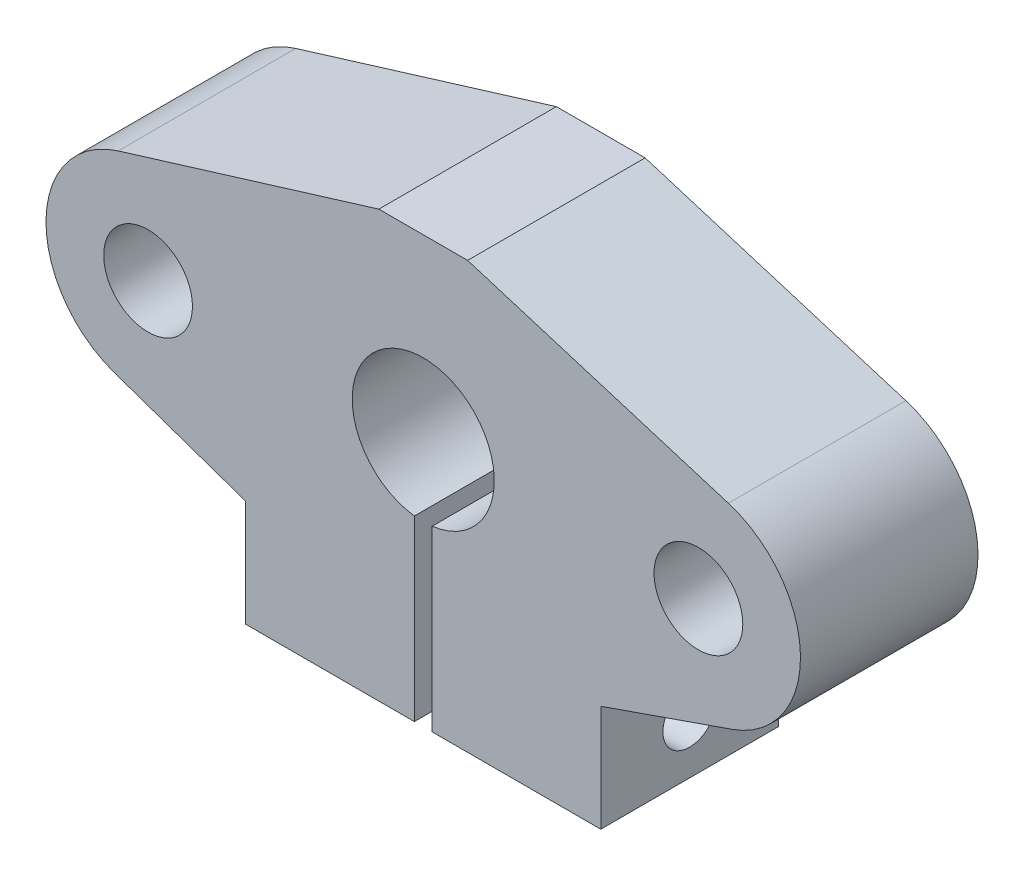
ISO-10303-21;
HEADER;
FILE_DESCRIPTION(('STEP AP214'),'2;1');
FILE_NAME('part.step','',(''),(''),'','','');
FILE_SCHEMA(('AUTOMOTIVE_DESIGN { 1 0 10303 214 1 1 1 1 }'));
ENDSEC;
DATA;
#1=APPLICATION_CONTEXT('core data for automotive mechanical design processes');
#2=APPLICATION_PROTOCOL_DEFINITION('international standard','automotive_design',2000,#1);
#3=PRODUCT_CONTEXT('',#1,'mechanical');
#4=PRODUCT('Part','Part','',(#3));
#5=PRODUCT_RELATED_PRODUCT_CATEGORY('part','',(#4));
#6=PRODUCT_DEFINITION_FORMATION('','',#4);
#7=PRODUCT_DEFINITION_CONTEXT('part definition',#1,'design');
#8=PRODUCT_DEFINITION('design','',#6,#7);
#9=PRODUCT_DEFINITION_SHAPE('','',#8);
#10=(LENGTH_UNIT() NAMED_UNIT(*) SI_UNIT(.MILLI.,.METRE.));
#11=(NAMED_UNIT(*) PLANE_ANGLE_UNIT() SI_UNIT($,.RADIAN.));
#12=(NAMED_UNIT(*) SI_UNIT($,.STERADIAN.) SOLID_ANGLE_UNIT());
#13=UNCERTAINTY_MEASURE_WITH_UNIT(LENGTH_MEASURE(1.E-05),#10,'distance_accuracy_value','');
#14=(GEOMETRIC_REPRESENTATION_CONTEXT(3) GLOBAL_UNCERTAINTY_ASSIGNED_CONTEXT((#13)) GLOBAL_UNIT_ASSIGNED_CONTEXT((#10,
#11,#12)) REPRESENTATION_CONTEXT('',''));
#15=CARTESIAN_POINT('',(0.,0.,0.));
#16=DIRECTION('',(0.,0.,1.));
#17=DIRECTION('',(1.,0.,0.));
#18=AXIS2_PLACEMENT_3D('',#15,#16,#17);
#19=CARTESIAN_POINT('',(15.5,1.99999999999999,10.));
#20=DIRECTION('',(0.,0.,-1.));
#21=DIRECTION('',(-1.,0.,0.));
#22=AXIS2_PLACEMENT_3D('',#19,#20,#21);
#23=CYLINDRICAL_SURFACE('',#22,5.74999999999223);
#24=CARTESIAN_POINT('',(15.5,1.99999999999999,0.));
#25=DIRECTION('',(0.,0.,1.));
#26=DIRECTION('',(1.,0.,0.));
#27=AXIS2_PLACEMENT_3D('',#24,#25,#26);
#28=CIRCLE('',#27,5.74999999999223);
#29=CARTESIAN_POINT('',(17.1855103593292,7.49741346712291,0.));
#30=VERTEX_POINT('',#29);
#31=CARTESIAN_POINT('',(17.3883763446684,-3.43107123694835,0.));
#32=VERTEX_POINT('',#31);
#33=EDGE_CURVE('E185',#30,#32,#28,.F.);
#34=ORIENTED_EDGE('',*,*,#33,.F.);
#35=DIRECTION('',(0.,0.,-1.));
#36=VECTOR('',#35,1.);
#37=CARTESIAN_POINT('',(17.1855103593292,7.49741346712291,10.));
#38=LINE('',#37,#36);
#39=CARTESIAN_POINT('',(17.1855103593292,7.49741346712291,10.));
#40=VERTEX_POINT('',#39);
#41=EDGE_CURVE('E11',#40,#30,#38,.T.);
#42=ORIENTED_EDGE('',*,*,#41,.F.);
#43=CARTESIAN_POINT('',(15.5,1.99999999999999,10.));
#44=DIRECTION('',(0.,0.,1.));
#45=DIRECTION('',(1.,0.,0.));
#46=AXIS2_PLACEMENT_3D('',#43,#44,#45);
#47=CIRCLE('',#46,5.74999999999223);
#48=CARTESIAN_POINT('',(17.3883763446684,-3.43107123694835,10.));
#49=VERTEX_POINT('',#48);
#50=EDGE_CURVE('E345',#40,#49,#47,.F.);
#51=ORIENTED_EDGE('',*,*,#50,.T.);
#52=DIRECTION('',(0.,0.,-1.));
#53=VECTOR('',#52,1.);
#54=CARTESIAN_POINT('',(17.3883763446684,-3.43107123694835,10.));
#55=LINE('',#54,#53);
#56=EDGE_CURVE('E114',#49,#32,#55,.T.);
#57=ORIENTED_EDGE('',*,*,#56,.T.);
#58=EDGE_LOOP('',(#34,#42,#51,#57));
#59=FACE_BOUND('',#58,.T.);
#60=ADVANCED_FACE('F44',(#59),#23,.T.);
#61=CARTESIAN_POINT('',(3.57788222635894,11.6695206446507,10.));
#62=DIRECTION('',(0.293132236405484,0.956071907327017,0.));
#63=DIRECTION('',(-0.956071907327017,0.293132236405484,0.));
#64=AXIS2_PLACEMENT_3D('',#61,#62,#63);
#65=PLANE('',#64);
#66=DIRECTION('',(0.956071907327017,-0.293132236405484,0.));
#67=VECTOR('',#66,1.);
#68=CARTESIAN_POINT('',(3.57788222635894,11.6695206446507,0.));
#69=LINE('',#68,#67);
#70=CARTESIAN_POINT('',(2.5,11.999999999993,0.));
#71=VERTEX_POINT('',#70);
#72=EDGE_CURVE('E188',#71,#30,#69,.T.);
#73=ORIENTED_EDGE('',*,*,#72,.F.);
#74=DIRECTION('',(0.,0.,-1.));
#75=VECTOR('',#74,1.);
#76=CARTESIAN_POINT('',(2.5,11.999999999993,10.));
#77=LINE('',#76,#75);
#78=CARTESIAN_POINT('',(2.5,11.999999999993,10.));
#79=VERTEX_POINT('',#78);
#80=EDGE_CURVE('E53',#79,#71,#77,.T.);
#81=ORIENTED_EDGE('',*,*,#80,.F.);
#82=DIRECTION('',(0.956071907327017,-0.293132236405484,0.));
#83=VECTOR('',#82,1.);
#84=CARTESIAN_POINT('',(3.57788222635894,11.6695206446507,10.));
#85=LINE('',#84,#83);
#86=EDGE_CURVE('E260',#79,#40,#85,.T.);
#87=ORIENTED_EDGE('',*,*,#86,.T.);
#88=ORIENTED_EDGE('',*,*,#41,.T.);
#89=EDGE_LOOP('',(#73,#81,#87,#88));
#90=FACE_BOUND('',#89,.T.);
#91=ADVANCED_FACE('F259',(#90),#65,.T.);
#92=CARTESIAN_POINT('',(0.,11.999999999993,10.));
#93=DIRECTION('',(0.,-1.,0.));
#94=DIRECTION('',(0.,0.,-1.));
#95=AXIS2_PLACEMENT_3D('',#92,#93,#94);
#96=PLANE('',#95);
#97=DIRECTION('',(-1.,0.,0.));
#98=VECTOR('',#97,1.);
#99=CARTESIAN_POINT('',(0.,11.999999999993,0.));
#100=LINE('',#99,#98);
#101=CARTESIAN_POINT('',(-2.5,11.999999999993,0.));
#102=VERTEX_POINT('',#101);
#103=EDGE_CURVE('E191',#71,#102,#100,.T.);
#104=ORIENTED_EDGE('',*,*,#103,.T.);
#105=DIRECTION('',(0.,0.,-1.));
#106=VECTOR('',#105,1.);
#107=CARTESIAN_POINT('',(-2.5,11.999999999993,10.));
#108=LINE('',#107,#106);
#109=CARTESIAN_POINT('',(-2.5,11.999999999993,10.));
#110=VERTEX_POINT('',#109);
#111=EDGE_CURVE('E244',#110,#102,#108,.T.);
#112=ORIENTED_EDGE('',*,*,#111,.F.);
#113=DIRECTION('',(-1.,0.,0.));
#114=VECTOR('',#113,1.);
#115=CARTESIAN_POINT('',(0.,11.999999999993,10.));
#116=LINE('',#115,#114);
#117=EDGE_CURVE('E252',#79,#110,#116,.T.);
#118=ORIENTED_EDGE('',*,*,#117,.F.);
#119=ORIENTED_EDGE('',*,*,#80,.T.);
#120=EDGE_LOOP('',(#104,#112,#118,#119));
#121=FACE_BOUND('',#120,.T.);
#122=ADVANCED_FACE('F249',(#121),#96,.F.);
#123=CARTESIAN_POINT('',(-3.57788222635894,11.6695206446507,10.));
#124=DIRECTION('',(0.293132236405483,-0.956071907327017,0.));
#125=DIRECTION('',(0.956071907327017,0.293132236405483,0.));
#126=AXIS2_PLACEMENT_3D('',#123,#124,#125);
#127=PLANE('',#126);
#128=DIRECTION('',(-0.956071907327017,-0.293132236405483,0.));
#129=VECTOR('',#128,1.);
#130=CARTESIAN_POINT('',(-3.57788222635894,11.6695206446507,0.));
#131=LINE('',#130,#129);
#132=CARTESIAN_POINT('',(-17.1855103593292,7.49741346712292,0.));
#133=VERTEX_POINT('',#132);
#134=EDGE_CURVE('E194',#102,#133,#131,.T.);
#135=ORIENTED_EDGE('',*,*,#134,.T.);
#136=DIRECTION('',(0.,0.,-1.));
#137=VECTOR('',#136,1.);
#138=CARTESIAN_POINT('',(-17.1855103593292,7.49741346712292,10.));
#139=LINE('',#138,#137);
#140=CARTESIAN_POINT('',(-17.1855103593292,7.49741346712292,10.));
#141=VERTEX_POINT('',#140);
#142=EDGE_CURVE('E241',#141,#133,#139,.T.);
#143=ORIENTED_EDGE('',*,*,#142,.F.);
#144=DIRECTION('',(-0.956071907327017,-0.293132236405483,0.));
#145=VECTOR('',#144,1.);
#146=CARTESIAN_POINT('',(-3.57788222635894,11.6695206446507,10.));
#147=LINE('',#146,#145);
#148=EDGE_CURVE('E349',#110,#141,#147,.T.);
#149=ORIENTED_EDGE('',*,*,#148,.F.);
#150=ORIENTED_EDGE('',*,*,#111,.T.);
#151=EDGE_LOOP('',(#135,#143,#149,#150));
#152=FACE_BOUND('',#151,.T.);
#153=ADVANCED_FACE('F269',(#152),#127,.F.);
#154=CARTESIAN_POINT('',(-15.5,2.,10.));
#155=DIRECTION('',(0.,0.,-1.));
#156=DIRECTION('',(-1.,0.,0.));
#157=AXIS2_PLACEMENT_3D('',#154,#155,#156);
#158=CYLINDRICAL_SURFACE('',#157,5.74999999999223);
#159=CARTESIAN_POINT('',(-15.5,2.,0.));
#160=DIRECTION('',(0.,0.,1.));
#161=DIRECTION('',(1.,0.,0.));
#162=AXIS2_PLACEMENT_3D('',#159,#160,#161);
#163=CIRCLE('',#162,5.74999999999223);
#164=CARTESIAN_POINT('',(-17.3883763446684,-3.43107123694835,0.));
#165=VERTEX_POINT('',#164);
#166=EDGE_CURVE('E197',#133,#165,#163,.T.);
#167=ORIENTED_EDGE('',*,*,#166,.T.);
#168=DIRECTION('',(0.,0.,-1.));
#169=VECTOR('',#168,1.);
#170=CARTESIAN_POINT('',(-17.3883763446684,-3.43107123694835,10.));
#171=LINE('',#170,#169);
#172=CARTESIAN_POINT('',(-17.3883763446684,-3.43107123694835,10.));
#173=VERTEX_POINT('',#172);
#174=EDGE_CURVE('E239',#173,#165,#171,.T.);
#175=ORIENTED_EDGE('',*,*,#174,.F.);
#176=CARTESIAN_POINT('',(-15.5,2.,10.));
#177=DIRECTION('',(0.,0.,1.));
#178=DIRECTION('',(1.,0.,0.));
#179=AXIS2_PLACEMENT_3D('',#176,#177,#178);
#180=CIRCLE('',#179,5.74999999999223);
#181=EDGE_CURVE('E352',#141,#173,#180,.T.);
#182=ORIENTED_EDGE('',*,*,#181,.F.);
#183=ORIENTED_EDGE('',*,*,#142,.T.);
#184=EDGE_LOOP('',(#167,#175,#182,#183));
#185=FACE_BOUND('',#184,.T.);
#186=ADVANCED_FACE('F272',(#185),#158,.T.);
#187=CARTESIAN_POINT('',(-2.93973809880274,-8.45484380147361,10.));
#188=DIRECTION('',(-0.328413277334074,-0.944534128166205,0.));
#189=DIRECTION('',(0.944534128166205,-0.328413277334074,0.));
#190=AXIS2_PLACEMENT_3D('',#187,#188,#189);
#191=PLANE('',#190);
#192=DIRECTION('',(-0.944534128166205,0.328413277334074,0.));
#193=VECTOR('',#192,1.);
#194=CARTESIAN_POINT('',(-2.93973809880274,-8.45484380147361,0.));
#195=LINE('',#194,#193);
#196=CARTESIAN_POINT('',(-10.,-6.,0.));
#197=VERTEX_POINT('',#196);
#198=EDGE_CURVE('E200',#197,#165,#195,.T.);
#199=ORIENTED_EDGE('',*,*,#198,.F.);
#200=DIRECTION('',(0.,0.,-1.));
#201=VECTOR('',#200,1.);
#202=CARTESIAN_POINT('',(-10.,-6.,10.));
#203=LINE('',#202,#201);
#204=CARTESIAN_POINT('',(-10.,-6.,10.));
#205=VERTEX_POINT('',#204);
#206=EDGE_CURVE('E237',#205,#197,#203,.T.);
#207=ORIENTED_EDGE('',*,*,#206,.F.);
#208=DIRECTION('',(-0.944534128166205,0.328413277334074,0.));
#209=VECTOR('',#208,1.);
#210=CARTESIAN_POINT('',(-2.93973809880274,-8.45484380147361,10.));
#211=LINE('',#210,#209);
#212=EDGE_CURVE('E354',#205,#173,#211,.T.);
#213=ORIENTED_EDGE('',*,*,#212,.T.);
#214=ORIENTED_EDGE('',*,*,#174,.T.);
#215=EDGE_LOOP('',(#199,#207,#213,#214));
#216=FACE_BOUND('',#215,.T.);
#217=ADVANCED_FACE('F276',(#216),#191,.T.);
#218=CARTESIAN_POINT('',(-10.,0.,10.));
#219=DIRECTION('',(-1.,0.,0.));
#220=DIRECTION('',(0.,0.,1.));
#221=AXIS2_PLACEMENT_3D('',#218,#219,#220);
#222=PLANE('',#221);
#223=CARTESIAN_POINT('',(-10.,-8.99999999999999,5.));
#224=DIRECTION('',(-1.,0.,0.));
#225=DIRECTION('',(0.,0.,1.));
#226=AXIS2_PLACEMENT_3D('',#223,#224,#225);
#227=CIRCLE('',#226,1.5);
#228=CARTESIAN_POINT('',(-10.,-8.99999999999999,6.5));
#229=VERTEX_POINT('',#228);
#230=EDGE_CURVE('E186',#229,#229,#227,.T.);
#231=ORIENTED_EDGE('',*,*,#230,.F.);
#232=EDGE_LOOP('',(#231));
#233=FACE_BOUND('',#232,.T.);
#234=DIRECTION('',(0.,1.,0.));
#235=VECTOR('',#234,1.);
#236=CARTESIAN_POINT('',(-10.,0.,0.));
#237=LINE('',#236,#235);
#238=CARTESIAN_POINT('',(-10.,-12.,0.));
#239=VERTEX_POINT('',#238);
#240=EDGE_CURVE('E203',#239,#197,#237,.T.);
#241=ORIENTED_EDGE('',*,*,#240,.F.);
#242=DIRECTION('',(0.,0.,-1.));
#243=VECTOR('',#242,1.);
#244=CARTESIAN_POINT('',(-10.,-12.,10.));
#245=LINE('',#244,#243);
#246=CARTESIAN_POINT('',(-10.,-12.,10.));
#247=VERTEX_POINT('',#246);
#248=EDGE_CURVE('E235',#247,#239,#245,.T.);
#249=ORIENTED_EDGE('',*,*,#248,.F.);
#250=DIRECTION('',(0.,1.,0.));
#251=VECTOR('',#250,1.);
#252=CARTESIAN_POINT('',(-10.,0.,10.));
#253=LINE('',#252,#251);
#254=EDGE_CURVE('E357',#247,#205,#253,.T.);
#255=ORIENTED_EDGE('',*,*,#254,.T.);
#256=ORIENTED_EDGE('',*,*,#206,.T.);
#257=EDGE_LOOP('',(#241,#249,#255,#256));
#258=FACE_BOUND('',#257,.T.);
#259=ADVANCED_FACE('F280',(#233,#258),#222,.T.);
#260=CARTESIAN_POINT('',(0.,-12.,10.));
#261=DIRECTION('',(0.,-1.,0.));
#262=DIRECTION('',(0.,0.,-1.));
#263=AXIS2_PLACEMENT_3D('',#260,#261,#262);
#264=PLANE('',#263);
#265=DIRECTION('',(-1.,0.,0.));
#266=VECTOR('',#265,1.);
#267=CARTESIAN_POINT('',(0.,-12.,0.));
#268=LINE('',#267,#266);
#269=CARTESIAN_POINT('',(-0.499999999999999,-12.,0.));
#270=VERTEX_POINT('',#269);
#271=EDGE_CURVE('E206',#270,#239,#268,.T.);
#272=ORIENTED_EDGE('',*,*,#271,.F.);
#273=DIRECTION('',(0.,0.,-1.));
#274=VECTOR('',#273,1.);
#275=CARTESIAN_POINT('',(-0.499999999999999,-12.,10.));
#276=LINE('',#275,#274);
#277=CARTESIAN_POINT('',(-0.499999999999999,-12.,10.));
#278=VERTEX_POINT('',#277);
#279=EDGE_CURVE('E233',#278,#270,#276,.T.);
#280=ORIENTED_EDGE('',*,*,#279,.F.);
#281=DIRECTION('',(-1.,0.,0.));
#282=VECTOR('',#281,1.);
#283=CARTESIAN_POINT('',(0.,-12.,10.));
#284=LINE('',#283,#282);
#285=EDGE_CURVE('E360',#278,#247,#284,.T.);
#286=ORIENTED_EDGE('',*,*,#285,.T.);
#287=ORIENTED_EDGE('',*,*,#248,.T.);
#288=EDGE_LOOP('',(#272,#280,#286,#287));
#289=FACE_BOUND('',#288,.T.);
#290=ADVANCED_FACE('F284',(#289),#264,.T.);
#291=CARTESIAN_POINT('',(-0.5,0.,10.));
#292=DIRECTION('',(1.,0.,0.));
#293=DIRECTION('',(0.,1.,0.));
#294=AXIS2_PLACEMENT_3D('',#291,#292,#293);
#295=PLANE('',#294);
#296=CARTESIAN_POINT('',(-0.5,-9.,5.));
#297=DIRECTION('',(1.,0.,0.));
#298=DIRECTION('',(0.,1.,0.));
#299=AXIS2_PLACEMENT_3D('',#296,#297,#298);
#300=CIRCLE('',#299,1.5);
#301=CARTESIAN_POINT('',(-0.500000000000001,-7.5,5.));
#302=VERTEX_POINT('',#301);
#303=EDGE_CURVE('E336',#302,#302,#300,.T.);
#304=ORIENTED_EDGE('',*,*,#303,.F.);
#305=EDGE_LOOP('',(#304));
#306=FACE_BOUND('',#305,.T.);
#307=DIRECTION('',(0.,-1.,0.));
#308=VECTOR('',#307,1.);
#309=CARTESIAN_POINT('',(-0.5,0.,0.));
#310=LINE('',#309,#308);
#311=CARTESIAN_POINT('',(-0.499999999999999,-1.96862696659689,0.));
#312=VERTEX_POINT('',#311);
#313=EDGE_CURVE('E209',#312,#270,#310,.T.);
#314=ORIENTED_EDGE('',*,*,#313,.F.);
#315=DIRECTION('',(0.,0.,-1.));
#316=VECTOR('',#315,1.);
#317=CARTESIAN_POINT('',(-0.499999999999999,-1.96862696659689,10.));
#318=LINE('',#317,#316);
#319=CARTESIAN_POINT('',(-0.499999999999999,-1.96862696659689,10.));
#320=VERTEX_POINT('',#319);
#321=EDGE_CURVE('E231',#320,#312,#318,.T.);
#322=ORIENTED_EDGE('',*,*,#321,.F.);
#323=DIRECTION('',(0.,-1.,0.));
#324=VECTOR('',#323,1.);
#325=CARTESIAN_POINT('',(-0.5,0.,10.));
#326=LINE('',#325,#324);
#327=EDGE_CURVE('E363',#320,#278,#326,.T.);
#328=ORIENTED_EDGE('',*,*,#327,.T.);
#329=ORIENTED_EDGE('',*,*,#279,.T.);
#330=EDGE_LOOP('',(#314,#322,#328,#329));
#331=FACE_BOUND('',#330,.T.);
#332=ADVANCED_FACE('F288',(#306,#331),#295,.T.);
#333=CARTESIAN_POINT('',(0.,2.,10.));
#334=DIRECTION('',(0.,0.,-1.));
#335=DIRECTION('',(-1.,0.,0.));
#336=AXIS2_PLACEMENT_3D('',#333,#334,#335);
#337=CYLINDRICAL_SURFACE('',#336,4.);
#338=CARTESIAN_POINT('',(0.,2.,0.));
#339=DIRECTION('',(0.,0.,1.));
#340=DIRECTION('',(1.,0.,0.));
#341=AXIS2_PLACEMENT_3D('',#338,#339,#340);
#342=CIRCLE('',#341,4.);
#343=CARTESIAN_POINT('',(0.500000000000001,-1.96862696659689,0.));
#344=VERTEX_POINT('',#343);
#345=EDGE_CURVE('E212',#344,#312,#342,.T.);
#346=ORIENTED_EDGE('',*,*,#345,.F.);
#347=DIRECTION('',(0.,0.,-1.));
#348=VECTOR('',#347,1.);
#349=CARTESIAN_POINT('',(0.500000000000001,-1.96862696659689,10.));
#350=LINE('',#349,#348);
#351=CARTESIAN_POINT('',(0.500000000000001,-1.96862696659689,10.));
#352=VERTEX_POINT('',#351);
#353=EDGE_CURVE('E229',#352,#344,#350,.T.);
#354=ORIENTED_EDGE('',*,*,#353,.F.);
#355=CARTESIAN_POINT('',(0.,2.,10.));
#356=DIRECTION('',(0.,0.,1.));
#357=DIRECTION('',(1.,0.,0.));
#358=AXIS2_PLACEMENT_3D('',#355,#356,#357);
#359=CIRCLE('',#358,4.);
#360=EDGE_CURVE('E174',#352,#320,#359,.T.);
#361=ORIENTED_EDGE('',*,*,#360,.T.);
#362=ORIENTED_EDGE('',*,*,#321,.T.);
#363=EDGE_LOOP('',(#346,#354,#361,#362));
#364=FACE_BOUND('',#363,.T.);
#365=ADVANCED_FACE('F292',(#364),#337,.F.);
#366=CARTESIAN_POINT('',(0.500000000000001,0.,10.));
#367=DIRECTION('',(-1.,0.,0.));
#368=DIRECTION('',(0.,0.,1.));
#369=AXIS2_PLACEMENT_3D('',#366,#367,#368);
#370=PLANE('',#369);
#371=CARTESIAN_POINT('',(0.5,-9.,5.));
#372=DIRECTION('',(-1.,0.,0.));
#373=DIRECTION('',(0.,0.,1.));
#374=AXIS2_PLACEMENT_3D('',#371,#372,#373);
#375=CIRCLE('',#374,1.5);
#376=CARTESIAN_POINT('',(0.5,-9.,6.5));
#377=VERTEX_POINT('',#376);
#378=EDGE_CURVE('E331',#377,#377,#375,.T.);
#379=ORIENTED_EDGE('',*,*,#378,.F.);
#380=EDGE_LOOP('',(#379));
#381=FACE_BOUND('',#380,.T.);
#382=DIRECTION('',(0.,1.,0.));
#383=VECTOR('',#382,1.);
#384=CARTESIAN_POINT('',(0.500000000000001,0.,0.));
#385=LINE('',#384,#383);
#386=CARTESIAN_POINT('',(0.5,-12.,0.));
#387=VERTEX_POINT('',#386);
#388=EDGE_CURVE('E215',#387,#344,#385,.T.);
#389=ORIENTED_EDGE('',*,*,#388,.F.);
#390=DIRECTION('',(0.,0.,-1.));
#391=VECTOR('',#390,1.);
#392=CARTESIAN_POINT('',(0.5,-12.,10.));
#393=LINE('',#392,#391);
#394=CARTESIAN_POINT('',(0.5,-12.,10.));
#395=VERTEX_POINT('',#394);
#396=EDGE_CURVE('E160',#395,#387,#393,.T.);
#397=ORIENTED_EDGE('',*,*,#396,.F.);
#398=DIRECTION('',(0.,1.,0.));
#399=VECTOR('',#398,1.);
#400=CARTESIAN_POINT('',(0.500000000000001,0.,10.));
#401=LINE('',#400,#399);
#402=EDGE_CURVE('E172',#395,#352,#401,.T.);
#403=ORIENTED_EDGE('',*,*,#402,.T.);
#404=ORIENTED_EDGE('',*,*,#353,.T.);
#405=EDGE_LOOP('',(#389,#397,#403,#404));
#406=FACE_BOUND('',#405,.T.);
#407=ADVANCED_FACE('F296',(#381,#406),#370,.T.);
#408=CARTESIAN_POINT('',(0.,-12.,10.));
#409=DIRECTION('',(0.,-1.,0.));
#410=DIRECTION('',(0.,0.,-1.));
#411=AXIS2_PLACEMENT_3D('',#408,#409,#410);
#412=PLANE('',#411);
#413=DIRECTION('',(-1.,0.,0.));
#414=VECTOR('',#413,1.);
#415=CARTESIAN_POINT('',(0.,-12.,0.));
#416=LINE('',#415,#414);
#417=CARTESIAN_POINT('',(10.,-12.,0.));
#418=VERTEX_POINT('',#417);
#419=EDGE_CURVE('E157',#418,#387,#416,.T.);
#420=ORIENTED_EDGE('',*,*,#419,.F.);
#421=DIRECTION('',(0.,0.,-1.));
#422=VECTOR('',#421,1.);
#423=CARTESIAN_POINT('',(10.,-12.,10.));
#424=LINE('',#423,#422);
#425=CARTESIAN_POINT('',(10.,-12.,10.));
#426=VERTEX_POINT('',#425);
#427=EDGE_CURVE('E151',#426,#418,#424,.T.);
#428=ORIENTED_EDGE('',*,*,#427,.F.);
#429=DIRECTION('',(-1.,0.,0.));
#430=VECTOR('',#429,1.);
#431=CARTESIAN_POINT('',(0.,-12.,10.));
#432=LINE('',#431,#430);
#433=EDGE_CURVE('E155',#426,#395,#432,.T.);
#434=ORIENTED_EDGE('',*,*,#433,.T.);
#435=ORIENTED_EDGE('',*,*,#396,.T.);
#436=EDGE_LOOP('',(#420,#428,#434,#435));
#437=FACE_BOUND('',#436,.T.);
#438=ADVANCED_FACE('F153',(#437),#412,.T.);
#439=CARTESIAN_POINT('',(10.,0.,10.));
#440=DIRECTION('',(-1.,0.,0.));
#441=DIRECTION('',(0.,-1.,0.));
#442=AXIS2_PLACEMENT_3D('',#439,#440,#441);
#443=PLANE('',#442);
#444=CARTESIAN_POINT('',(10.,-9.,5.));
#445=DIRECTION('',(1.,0.,0.));
#446=DIRECTION('',(0.,1.,0.));
#447=AXIS2_PLACEMENT_3D('',#444,#445,#446);
#448=CIRCLE('',#447,1.5);
#449=CARTESIAN_POINT('',(10.,-7.5,5.));
#450=VERTEX_POINT('',#449);
#451=EDGE_CURVE('E334',#450,#450,#448,.T.);
#452=ORIENTED_EDGE('',*,*,#451,.F.);
#453=EDGE_LOOP('',(#452));
#454=FACE_BOUND('',#453,.T.);
#455=DIRECTION('',(0.,1.,0.));
#456=VECTOR('',#455,1.);
#457=CARTESIAN_POINT('',(10.,0.,0.));
#458=LINE('',#457,#456);
#459=CARTESIAN_POINT('',(10.,-6.,0.));
#460=VERTEX_POINT('',#459);
#461=EDGE_CURVE('E219',#418,#460,#458,.T.);
#462=ORIENTED_EDGE('',*,*,#461,.T.);
#463=DIRECTION('',(0.,0.,-1.));
#464=VECTOR('',#463,1.);
#465=CARTESIAN_POINT('',(10.,-6.,10.));
#466=LINE('',#465,#464);
#467=CARTESIAN_POINT('',(10.,-6.,10.));
#468=VERTEX_POINT('',#467);
#469=EDGE_CURVE('E161',#468,#460,#466,.T.);
#470=ORIENTED_EDGE('',*,*,#469,.F.);
#471=DIRECTION('',(0.,1.,0.));
#472=VECTOR('',#471,1.);
#473=CARTESIAN_POINT('',(10.,0.,10.));
#474=LINE('',#473,#472);
#475=EDGE_CURVE('E164',#426,#468,#474,.T.);
#476=ORIENTED_EDGE('',*,*,#475,.F.);
#477=ORIENTED_EDGE('',*,*,#427,.T.);
#478=EDGE_LOOP('',(#462,#470,#476,#477));
#479=FACE_BOUND('',#478,.T.);
#480=ADVANCED_FACE('F165',(#454,#479),#443,.F.);
#481=CARTESIAN_POINT('',(2.93973809880274,-8.45484380147361,10.));
#482=DIRECTION('',(-0.328413277334073,0.944534128166205,0.));
#483=DIRECTION('',(-0.944534128166205,-0.328413277334073,0.));
#484=AXIS2_PLACEMENT_3D('',#481,#482,#483);
#485=PLANE('',#484);
#486=DIRECTION('',(0.944534128166205,0.328413277334073,0.));
#487=VECTOR('',#486,1.);
#488=CARTESIAN_POINT('',(2.93973809880274,-8.45484380147361,0.));
#489=LINE('',#488,#487);
#490=EDGE_CURVE('E107',#460,#32,#489,.T.);
#491=ORIENTED_EDGE('',*,*,#490,.T.);
#492=ORIENTED_EDGE('',*,*,#56,.F.);
#493=DIRECTION('',(0.944534128166205,0.328413277334073,0.));
#494=VECTOR('',#493,1.);
#495=CARTESIAN_POINT('',(2.93973809880274,-8.45484380147361,10.));
#496=LINE('',#495,#494);
#497=EDGE_CURVE('E61',#468,#49,#496,.T.);
#498=ORIENTED_EDGE('',*,*,#497,.F.);
#499=ORIENTED_EDGE('',*,*,#469,.T.);
#500=EDGE_LOOP('',(#491,#492,#498,#499));
#501=FACE_BOUND('',#500,.T.);
#502=ADVANCED_FACE('F305',(#501),#485,.F.);
#503=CARTESIAN_POINT('',(-15.5,2.,10.));
#504=DIRECTION('',(0.,0.,-1.));
#505=DIRECTION('',(-1.,0.,0.));
#506=AXIS2_PLACEMENT_3D('',#503,#504,#505);
#507=CYLINDRICAL_SURFACE('',#506,2.5);
#508=CARTESIAN_POINT('',(-15.5,2.,10.));
#509=DIRECTION('',(0.,0.,1.));
#510=DIRECTION('',(1.,0.,0.));
#511=AXIS2_PLACEMENT_3D('',#508,#509,#510);
#512=CIRCLE('',#511,2.5);
#513=CARTESIAN_POINT('',(-13.,2.,10.));
#514=VERTEX_POINT('',#513);
#515=EDGE_CURVE('E225',#514,#514,#512,.T.);
#516=ORIENTED_EDGE('',*,*,#515,.T.);
#517=EDGE_LOOP('',(#516));
#518=FACE_BOUND('',#517,.T.);
#519=CARTESIAN_POINT('',(-15.5,2.,0.));
#520=DIRECTION('',(0.,0.,1.));
#521=DIRECTION('',(1.,0.,0.));
#522=AXIS2_PLACEMENT_3D('',#519,#520,#521);
#523=CIRCLE('',#522,2.5);
#524=CARTESIAN_POINT('',(-13.,2.,0.));
#525=VERTEX_POINT('',#524);
#526=EDGE_CURVE('E182',#525,#525,#523,.T.);
#527=ORIENTED_EDGE('',*,*,#526,.F.);
#528=EDGE_LOOP('',(#527));
#529=FACE_BOUND('',#528,.T.);
#530=ADVANCED_FACE('F46',(#518,#529),#507,.F.);
#531=CARTESIAN_POINT('',(15.5,1.99999999999999,10.));
#532=DIRECTION('',(0.,0.,-1.));
#533=DIRECTION('',(-1.,0.,0.));
#534=AXIS2_PLACEMENT_3D('',#531,#532,#533);
#535=CYLINDRICAL_SURFACE('',#534,2.5);
#536=CARTESIAN_POINT('',(15.5,1.99999999999999,10.));
#537=DIRECTION('',(0.,0.,1.));
#538=DIRECTION('',(1.,0.,0.));
#539=AXIS2_PLACEMENT_3D('',#536,#537,#538);
#540=CIRCLE('',#539,2.5);
#541=CARTESIAN_POINT('',(18.,1.99999999999999,10.));
#542=VERTEX_POINT('',#541);
#543=EDGE_CURVE('E179',#542,#542,#540,.F.);
#544=ORIENTED_EDGE('',*,*,#543,.F.);
#545=EDGE_LOOP('',(#544));
#546=FACE_BOUND('',#545,.T.);
#547=CARTESIAN_POINT('',(15.5,1.99999999999999,0.));
#548=DIRECTION('',(0.,0.,1.));
#549=DIRECTION('',(1.,0.,0.));
#550=AXIS2_PLACEMENT_3D('',#547,#548,#549);
#551=CIRCLE('',#550,2.5);
#552=CARTESIAN_POINT('',(18.,1.99999999999999,0.));
#553=VERTEX_POINT('',#552);
#554=EDGE_CURVE('E222',#553,#553,#551,.F.);
#555=ORIENTED_EDGE('',*,*,#554,.T.);
#556=EDGE_LOOP('',(#555));
#557=FACE_BOUND('',#556,.T.);
#558=ADVANCED_FACE('F310',(#546,#557),#535,.F.);
#559=CARTESIAN_POINT('',(0.,0.,10.));
#560=DIRECTION('',(0.,0.,1.));
#561=DIRECTION('',(1.,0.,0.));
#562=AXIS2_PLACEMENT_3D('',#559,#560,#561);
#563=PLANE('',#562);
#564=ORIENTED_EDGE('',*,*,#515,.F.);
#565=EDGE_LOOP('',(#564));
#566=FACE_BOUND('',#565,.T.);
#567=ORIENTED_EDGE('',*,*,#50,.F.);
#568=ORIENTED_EDGE('',*,*,#86,.F.);
#569=ORIENTED_EDGE('',*,*,#117,.T.);
#570=ORIENTED_EDGE('',*,*,#148,.T.);
#571=ORIENTED_EDGE('',*,*,#181,.T.);
#572=ORIENTED_EDGE('',*,*,#212,.F.);
#573=ORIENTED_EDGE('',*,*,#254,.F.);
#574=ORIENTED_EDGE('',*,*,#285,.F.);
#575=ORIENTED_EDGE('',*,*,#327,.F.);
#576=ORIENTED_EDGE('',*,*,#360,.F.);
#577=ORIENTED_EDGE('',*,*,#402,.F.);
#578=ORIENTED_EDGE('',*,*,#433,.F.);
#579=ORIENTED_EDGE('',*,*,#475,.T.);
#580=ORIENTED_EDGE('',*,*,#497,.T.);
#581=EDGE_LOOP('',(#567,#568,#569,#570,#571,#572,#573,#574,#575,#576,#577,#578,#579,#580));
#582=FACE_BOUND('',#581,.T.);
#583=ORIENTED_EDGE('',*,*,#543,.T.);
#584=EDGE_LOOP('',(#583));
#585=FACE_BOUND('',#584,.T.);
#586=ADVANCED_FACE('F168',(#566,#582,#585),#563,.T.);
#587=CARTESIAN_POINT('',(0.,0.,0.));
#588=DIRECTION('',(0.,0.,1.));
#589=DIRECTION('',(1.,0.,0.));
#590=AXIS2_PLACEMENT_3D('',#587,#588,#589);
#591=PLANE('',#590);
#592=ORIENTED_EDGE('',*,*,#526,.T.);
#593=EDGE_LOOP('',(#592));
#594=FACE_BOUND('',#593,.T.);
#595=ORIENTED_EDGE('',*,*,#33,.T.);
#596=ORIENTED_EDGE('',*,*,#490,.F.);
#597=ORIENTED_EDGE('',*,*,#461,.F.);
#598=ORIENTED_EDGE('',*,*,#419,.T.);
#599=ORIENTED_EDGE('',*,*,#388,.T.);
#600=ORIENTED_EDGE('',*,*,#345,.T.);
#601=ORIENTED_EDGE('',*,*,#313,.T.);
#602=ORIENTED_EDGE('',*,*,#271,.T.);
#603=ORIENTED_EDGE('',*,*,#240,.T.);
#604=ORIENTED_EDGE('',*,*,#198,.T.);
#605=ORIENTED_EDGE('',*,*,#166,.F.);
#606=ORIENTED_EDGE('',*,*,#134,.F.);
#607=ORIENTED_EDGE('',*,*,#103,.F.);
#608=ORIENTED_EDGE('',*,*,#72,.T.);
#609=EDGE_LOOP('',(#595,#596,#597,#598,#599,#600,#601,#602,#603,#604,#605,#606,#607,#608));
#610=FACE_BOUND('',#609,.T.);
#611=ORIENTED_EDGE('',*,*,#554,.F.);
#612=EDGE_LOOP('',(#611));
#613=FACE_BOUND('',#612,.T.);
#614=ADVANCED_FACE('F257',(#594,#610,#613),#591,.F.);
#615=CARTESIAN_POINT('',(-21.2499999999922,-8.99999999999998,5.));
#616=DIRECTION('',(1.,0.,0.));
#617=DIRECTION('',(0.,1.,0.));
#618=AXIS2_PLACEMENT_3D('',#615,#616,#617);
#619=CYLINDRICAL_SURFACE('',#618,1.5);
#620=ORIENTED_EDGE('',*,*,#378,.T.);
#621=EDGE_LOOP('',(#620));
#622=FACE_BOUND('',#621,.T.);
#623=ORIENTED_EDGE('',*,*,#451,.T.);
#624=EDGE_LOOP('',(#623));
#625=FACE_BOUND('',#624,.T.);
#626=ADVANCED_FACE('F316',(#622,#625),#619,.F.);
#627=ORIENTED_EDGE('',*,*,#230,.T.);
#628=EDGE_LOOP('',(#627));
#629=FACE_BOUND('',#628,.T.);
#630=ORIENTED_EDGE('',*,*,#303,.T.);
#631=EDGE_LOOP('',(#630));
#632=FACE_BOUND('',#631,.T.);
#633=ADVANCED_FACE('F322',(#629,#632),#619,.F.);
#634=CLOSED_SHELL('',(#60,#91,#122,#153,#186,#217,#259,#290,#332,#365,#407,#438,#480,#502,#530,
#558,#586,#614,#626,#633));
#635=MANIFOLD_SOLID_BREP('B2',#634);
#636=ADVANCED_BREP_SHAPE_REPRESENTATION('',(#18,#635),#14);
#637=SHAPE_DEFINITION_REPRESENTATION(#9,#636);
ENDSEC;
END-ISO-10303-21;
